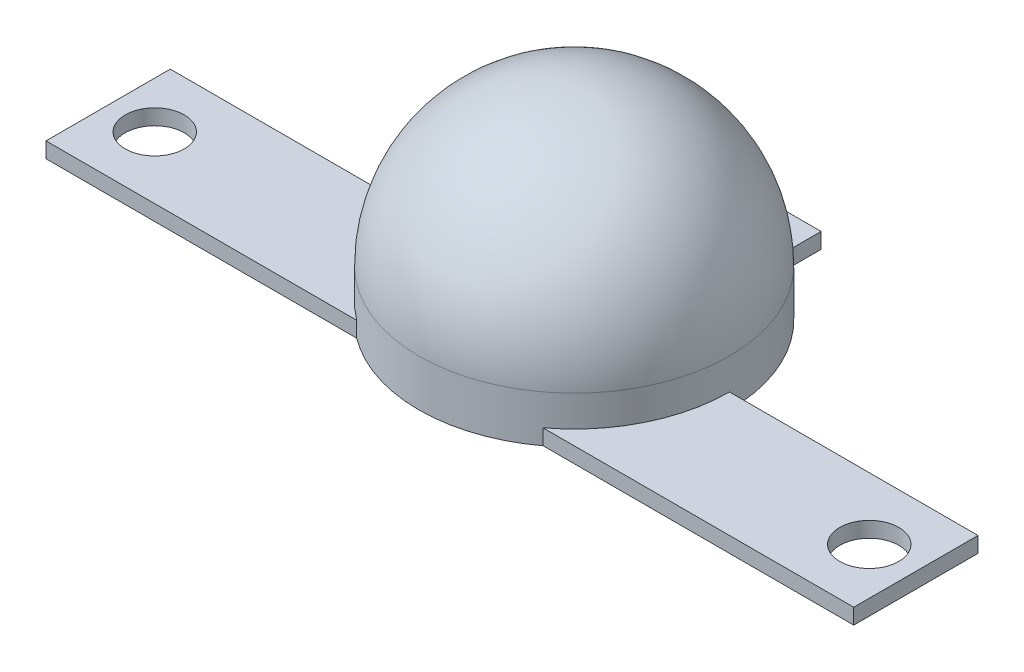
ISO-10303-21;
HEADER;
FILE_DESCRIPTION(('STEP AP214'),'2;1');
FILE_NAME('part.step','',(''),(''),'','','');
FILE_SCHEMA(('AUTOMOTIVE_DESIGN { 1 0 10303 214 1 1 1 1 }'));
ENDSEC;
DATA;
#1=APPLICATION_CONTEXT('core data for automotive mechanical design processes');
#2=APPLICATION_PROTOCOL_DEFINITION('international standard','automotive_design',2000,#1);
#3=PRODUCT_CONTEXT('',#1,'mechanical');
#4=PRODUCT('Part','Part','',(#3));
#5=PRODUCT_RELATED_PRODUCT_CATEGORY('part','',(#4));
#6=PRODUCT_DEFINITION_FORMATION('','',#4);
#7=PRODUCT_DEFINITION_CONTEXT('part definition',#1,'design');
#8=PRODUCT_DEFINITION('design','',#6,#7);
#9=PRODUCT_DEFINITION_SHAPE('','',#8);
#10=(LENGTH_UNIT() NAMED_UNIT(*) SI_UNIT(.MILLI.,.METRE.));
#11=(NAMED_UNIT(*) PLANE_ANGLE_UNIT() SI_UNIT($,.RADIAN.));
#12=(NAMED_UNIT(*) SI_UNIT($,.STERADIAN.) SOLID_ANGLE_UNIT());
#13=UNCERTAINTY_MEASURE_WITH_UNIT(LENGTH_MEASURE(1.E-05),#10,'distance_accuracy_value','');
#14=(GEOMETRIC_REPRESENTATION_CONTEXT(3) GLOBAL_UNCERTAINTY_ASSIGNED_CONTEXT((#13)) GLOBAL_UNIT_ASSIGNED_CONTEXT((#10,
#11,#12)) REPRESENTATION_CONTEXT('',''));
#15=CARTESIAN_POINT('',(0.,0.,0.));
#16=DIRECTION('',(0.,0.,1.));
#17=DIRECTION('',(1.,0.,0.));
#18=AXIS2_PLACEMENT_3D('',#15,#16,#17);
#19=CARTESIAN_POINT('',(0.,13.,0.));
#20=DIRECTION('',(0.,1.,0.));
#21=DIRECTION('',(0.,0.,1.));
#22=AXIS2_PLACEMENT_3D('',#19,#20,#21);
#23=CYLINDRICAL_SURFACE('',#22,10.);
#24=CARTESIAN_POINT('',(0.,3.,0.));
#25=DIRECTION('',(0.,1.,0.));
#26=DIRECTION('',(0.,0.,1.));
#27=AXIS2_PLACEMENT_3D('',#24,#25,#26);
#28=CIRCLE('',#27,10.);
#29=CARTESIAN_POINT('',(0.,3.,10.));
#30=VERTEX_POINT('',#29);
#31=EDGE_CURVE('E281',#30,#30,#28,.T.);
#32=ORIENTED_EDGE('',*,*,#31,.F.);
#33=EDGE_LOOP('',(#32));
#34=FACE_BOUND('',#33,.T.);
#35=CARTESIAN_POINT('',(0.,0.,0.));
#36=DIRECTION('',(0.,1.,0.));
#37=DIRECTION('',(0.,0.,1.));
#38=AXIS2_PLACEMENT_3D('',#35,#36,#37);
#39=CIRCLE('',#38,10.);
#40=CARTESIAN_POINT('',(-6.,0.,8.));
#41=VERTEX_POINT('',#40);
#42=CARTESIAN_POINT('',(6.,0.,8.));
#43=VERTEX_POINT('',#42);
#44=EDGE_CURVE('E270',#41,#43,#39,.T.);
#45=ORIENTED_EDGE('',*,*,#44,.T.);
#46=DIRECTION('',(0.,1.,0.));
#47=VECTOR('',#46,1.);
#48=CARTESIAN_POINT('',(6.,13.,8.));
#49=LINE('',#48,#47);
#50=CARTESIAN_POINT('',(6.,0.999999999999999,8.));
#51=VERTEX_POINT('',#50);
#52=EDGE_CURVE('E61',#43,#51,#49,.T.);
#53=ORIENTED_EDGE('',*,*,#52,.T.);
#54=CARTESIAN_POINT('',(0.,0.999999999999999,0.));
#55=DIRECTION('',(0.,1.,0.));
#56=DIRECTION('',(0.,0.,1.));
#57=AXIS2_PLACEMENT_3D('',#54,#55,#56);
#58=CIRCLE('',#57,10.);
#59=CARTESIAN_POINT('',(10.,0.999999999999999,0.));
#60=VERTEX_POINT('',#59);
#61=EDGE_CURVE('E56',#51,#60,#58,.T.);
#62=ORIENTED_EDGE('',*,*,#61,.T.);
#63=DIRECTION('',(0.,1.,0.));
#64=VECTOR('',#63,1.);
#65=CARTESIAN_POINT('',(10.,13.,0.));
#66=LINE('',#65,#64);
#67=CARTESIAN_POINT('',(10.,0.,0.));
#68=VERTEX_POINT('',#67);
#69=EDGE_CURVE('E255',#68,#60,#66,.T.);
#70=ORIENTED_EDGE('',*,*,#69,.F.);
#71=CARTESIAN_POINT('',(4.,0.,-9.16515138991168));
#72=VERTEX_POINT('',#71);
#73=EDGE_CURVE('E273',#68,#72,#39,.T.);
#74=ORIENTED_EDGE('',*,*,#73,.T.);
#75=DIRECTION('',(0.,1.,0.));
#76=VECTOR('',#75,1.);
#77=CARTESIAN_POINT('',(4.,13.,-9.16515138991168));
#78=LINE('',#77,#76);
#79=CARTESIAN_POINT('',(4.,0.999999999999999,-9.16515138991168));
#80=VERTEX_POINT('',#79);
#81=EDGE_CURVE('E249',#80,#72,#78,.F.);
#82=ORIENTED_EDGE('',*,*,#81,.F.);
#83=CARTESIAN_POINT('',(-4.,0.999999999999999,-9.16515138991168));
#84=VERTEX_POINT('',#83);
#85=EDGE_CURVE('E269',#80,#84,#58,.T.);
#86=ORIENTED_EDGE('',*,*,#85,.T.);
#87=DIRECTION('',(0.,1.,0.));
#88=VECTOR('',#87,1.);
#89=CARTESIAN_POINT('',(-4.,13.,-9.16515138991168));
#90=LINE('',#89,#88);
#91=CARTESIAN_POINT('',(-4.,0.,-9.16515138991168));
#92=VERTEX_POINT('',#91);
#93=EDGE_CURVE('E244',#84,#92,#90,.F.);
#94=ORIENTED_EDGE('',*,*,#93,.T.);
#95=CARTESIAN_POINT('',(-10.,0.,0.));
#96=VERTEX_POINT('',#95);
#97=EDGE_CURVE('E272',#92,#96,#39,.T.);
#98=ORIENTED_EDGE('',*,*,#97,.T.);
#99=DIRECTION('',(0.,1.,0.));
#100=VECTOR('',#99,1.);
#101=CARTESIAN_POINT('',(-10.,13.,0.));
#102=LINE('',#101,#100);
#103=CARTESIAN_POINT('',(-10.,0.999999999999999,0.));
#104=VERTEX_POINT('',#103);
#105=EDGE_CURVE('E238',#104,#96,#102,.F.);
#106=ORIENTED_EDGE('',*,*,#105,.F.);
#107=CARTESIAN_POINT('',(-6.,0.999999999999999,8.));
#108=VERTEX_POINT('',#107);
#109=EDGE_CURVE('E267',#104,#108,#58,.T.);
#110=ORIENTED_EDGE('',*,*,#109,.T.);
#111=DIRECTION('',(0.,1.,0.));
#112=VECTOR('',#111,1.);
#113=CARTESIAN_POINT('',(-6.,13.,8.));
#114=LINE('',#113,#112);
#115=EDGE_CURVE('E263',#108,#41,#114,.F.);
#116=ORIENTED_EDGE('',*,*,#115,.T.);
#117=EDGE_LOOP('',(#45,#53,#62,#70,#74,#82,#86,#94,#98,#106,#110,#116));
#118=FACE_BOUND('',#117,.T.);
#119=ADVANCED_FACE('F41',(#34,#118),#23,.T.);
#120=CARTESIAN_POINT('',(0.,13.,0.));
#121=DIRECTION('',(0.,1.,0.));
#122=DIRECTION('',(0.,0.,1.));
#123=AXIS2_PLACEMENT_3D('',#120,#121,#122);
#124=CYLINDRICAL_SURFACE('',#123,8.8);
#125=CARTESIAN_POINT('',(0.,3.,0.));
#126=DIRECTION('',(0.,1.,0.));
#127=DIRECTION('',(0.,0.,1.));
#128=AXIS2_PLACEMENT_3D('',#125,#126,#127);
#129=CIRCLE('',#128,8.8);
#130=CARTESIAN_POINT('',(0.,3.,8.8));
#131=VERTEX_POINT('',#130);
#132=EDGE_CURVE('E279',#131,#131,#129,.T.);
#133=ORIENTED_EDGE('',*,*,#132,.T.);
#134=EDGE_LOOP('',(#133));
#135=FACE_BOUND('',#134,.T.);
#136=CARTESIAN_POINT('',(0.,0.,0.));
#137=DIRECTION('',(0.,1.,0.));
#138=DIRECTION('',(0.,0.,1.));
#139=AXIS2_PLACEMENT_3D('',#136,#137,#138);
#140=CIRCLE('',#139,8.8);
#141=CARTESIAN_POINT('',(-3.66606055596467,0.,8.));
#142=VERTEX_POINT('',#141);
#143=CARTESIAN_POINT('',(3.66606055596468,0.,8.));
#144=VERTEX_POINT('',#143);
#145=EDGE_CURVE('E274',#142,#144,#140,.T.);
#146=ORIENTED_EDGE('',*,*,#145,.F.);
#147=DIRECTION('',(0.,1.,0.));
#148=VECTOR('',#147,1.);
#149=CARTESIAN_POINT('',(-3.66606055596467,13.,8.));
#150=LINE('',#149,#148);
#151=CARTESIAN_POINT('',(-3.66606055596467,0.999999999999999,8.));
#152=VERTEX_POINT('',#151);
#153=EDGE_CURVE('E257',#142,#152,#150,.T.);
#154=ORIENTED_EDGE('',*,*,#153,.T.);
#155=CARTESIAN_POINT('',(0.,0.999999999999999,0.));
#156=DIRECTION('',(0.,1.,0.));
#157=DIRECTION('',(0.,0.,1.));
#158=AXIS2_PLACEMENT_3D('',#155,#156,#157);
#159=CIRCLE('',#158,8.8);
#160=CARTESIAN_POINT('',(-8.8,0.999999999999999,0.));
#161=VERTEX_POINT('',#160);
#162=EDGE_CURVE('E11',#152,#161,#159,.F.);
#163=ORIENTED_EDGE('',*,*,#162,.T.);
#164=DIRECTION('',(0.,1.,0.));
#165=VECTOR('',#164,1.);
#166=CARTESIAN_POINT('',(-8.8,13.,0.));
#167=LINE('',#166,#165);
#168=CARTESIAN_POINT('',(-8.8,0.,0.));
#169=VERTEX_POINT('',#168);
#170=EDGE_CURVE('E186',#169,#161,#167,.T.);
#171=ORIENTED_EDGE('',*,*,#170,.F.);
#172=CARTESIAN_POINT('',(-4.,0.,-7.83836717690617));
#173=VERTEX_POINT('',#172);
#174=EDGE_CURVE('E277',#173,#169,#140,.T.);
#175=ORIENTED_EDGE('',*,*,#174,.F.);
#176=DIRECTION('',(0.,1.,0.));
#177=VECTOR('',#176,1.);
#178=CARTESIAN_POINT('',(-4.,13.,-7.83836717690617));
#179=LINE('',#178,#177);
#180=CARTESIAN_POINT('',(-4.,0.999999999999999,-7.83836717690617));
#181=VERTEX_POINT('',#180);
#182=EDGE_CURVE('E241',#173,#181,#179,.T.);
#183=ORIENTED_EDGE('',*,*,#182,.T.);
#184=CARTESIAN_POINT('',(4.,0.999999999999999,-7.83836717690617));
#185=VERTEX_POINT('',#184);
#186=EDGE_CURVE('E49',#181,#185,#159,.F.);
#187=ORIENTED_EDGE('',*,*,#186,.T.);
#188=DIRECTION('',(0.,1.,0.));
#189=VECTOR('',#188,1.);
#190=CARTESIAN_POINT('',(4.,13.,-7.83836717690617));
#191=LINE('',#190,#189);
#192=CARTESIAN_POINT('',(4.,0.,-7.83836717690617));
#193=VERTEX_POINT('',#192);
#194=EDGE_CURVE('E247',#193,#185,#191,.T.);
#195=ORIENTED_EDGE('',*,*,#194,.F.);
#196=CARTESIAN_POINT('',(8.8,0.,0.));
#197=VERTEX_POINT('',#196);
#198=EDGE_CURVE('E278',#197,#193,#140,.T.);
#199=ORIENTED_EDGE('',*,*,#198,.F.);
#200=DIRECTION('',(0.,1.,0.));
#201=VECTOR('',#200,1.);
#202=CARTESIAN_POINT('',(8.8,13.,0.));
#203=LINE('',#202,#201);
#204=CARTESIAN_POINT('',(8.8,0.999999999999999,0.));
#205=VERTEX_POINT('',#204);
#206=EDGE_CURVE('E252',#205,#197,#203,.F.);
#207=ORIENTED_EDGE('',*,*,#206,.F.);
#208=CARTESIAN_POINT('',(3.66606055596468,0.999999999999999,8.));
#209=VERTEX_POINT('',#208);
#210=EDGE_CURVE('E44',#205,#209,#159,.F.);
#211=ORIENTED_EDGE('',*,*,#210,.T.);
#212=DIRECTION('',(0.,1.,0.));
#213=VECTOR('',#212,1.);
#214=CARTESIAN_POINT('',(3.66606055596468,13.,8.));
#215=LINE('',#214,#213);
#216=EDGE_CURVE('E260',#209,#144,#215,.F.);
#217=ORIENTED_EDGE('',*,*,#216,.T.);
#218=EDGE_LOOP('',(#146,#154,#163,#171,#175,#183,#187,#195,#199,#207,#211,#217));
#219=FACE_BOUND('',#218,.T.);
#220=ADVANCED_FACE('F291',(#135,#219),#124,.F.);
#221=CARTESIAN_POINT('',(0.,3.,0.));
#222=DIRECTION('',(0.,1.,0.));
#223=DIRECTION('',(1.,0.,0.));
#224=AXIS2_PLACEMENT_3D('',#221,#222,#223);
#225=SPHERICAL_SURFACE('',#224,10.);
#226=ORIENTED_EDGE('',*,*,#31,.T.);
#227=EDGE_LOOP('',(#226));
#228=FACE_BOUND('',#227,.T.);
#229=ADVANCED_FACE('F389',(#228),#225,.T.);
#230=CARTESIAN_POINT('',(0.,3.,0.));
#231=DIRECTION('',(0.,1.,0.));
#232=DIRECTION('',(-1.,0.,0.));
#233=AXIS2_PLACEMENT_3D('',#230,#231,#232);
#234=SPHERICAL_SURFACE('',#233,8.8);
#235=ORIENTED_EDGE('',*,*,#132,.F.);
#236=EDGE_LOOP('',(#235));
#237=FACE_BOUND('',#236,.T.);
#238=ADVANCED_FACE('F395',(#237),#234,.F.);
#239=CARTESIAN_POINT('',(8.8,0.,0.));
#240=DIRECTION('',(0.,1.,0.));
#241=DIRECTION('',(0.,0.,1.));
#242=AXIS2_PLACEMENT_3D('',#239,#240,#241);
#243=PLANE('',#242);
#244=DIRECTION('',(-1.,0.,0.));
#245=VECTOR('',#244,1.);
#246=CARTESIAN_POINT('',(0.,0.,8.));
#247=LINE('',#246,#245);
#248=EDGE_CURVE('E328',#144,#142,#247,.T.);
#249=ORIENTED_EDGE('',*,*,#248,.T.);
#250=ORIENTED_EDGE('',*,*,#145,.T.);
#251=EDGE_LOOP('',(#249,#250));
#252=FACE_BOUND('',#251,.T.);
#253=DIRECTION('',(0.,0.,-1.));
#254=VECTOR('',#253,1.);
#255=CARTESIAN_POINT('',(-4.,0.,0.));
#256=LINE('',#255,#254);
#257=CARTESIAN_POINT('',(-4.,0.,0.));
#258=VERTEX_POINT('',#257);
#259=EDGE_CURVE('E342',#258,#173,#256,.T.);
#260=ORIENTED_EDGE('',*,*,#259,.T.);
#261=ORIENTED_EDGE('',*,*,#174,.T.);
#262=DIRECTION('',(-1.,0.,0.));
#263=VECTOR('',#262,1.);
#264=CARTESIAN_POINT('',(0.,0.,0.));
#265=LINE('',#264,#263);
#266=EDGE_CURVE('E345',#258,#169,#265,.T.);
#267=ORIENTED_EDGE('',*,*,#266,.F.);
#268=EDGE_LOOP('',(#260,#261,#267));
#269=FACE_BOUND('',#268,.T.);
#270=ORIENTED_EDGE('',*,*,#198,.T.);
#271=DIRECTION('',(0.,0.,-1.));
#272=VECTOR('',#271,1.);
#273=CARTESIAN_POINT('',(4.,0.,0.));
#274=LINE('',#273,#272);
#275=CARTESIAN_POINT('',(4.,0.,0.));
#276=VERTEX_POINT('',#275);
#277=EDGE_CURVE('E336',#276,#193,#274,.T.);
#278=ORIENTED_EDGE('',*,*,#277,.F.);
#279=DIRECTION('',(-1.,0.,0.));
#280=VECTOR('',#279,1.);
#281=CARTESIAN_POINT('',(0.,0.,0.));
#282=LINE('',#281,#280);
#283=EDGE_CURVE('E331',#197,#276,#282,.T.);
#284=ORIENTED_EDGE('',*,*,#283,.F.);
#285=EDGE_LOOP('',(#270,#278,#284));
#286=FACE_BOUND('',#285,.T.);
#287=ORIENTED_EDGE('',*,*,#97,.F.);
#288=CARTESIAN_POINT('',(-4.,0.,-11.9));
#289=VERTEX_POINT('',#288);
#290=EDGE_CURVE('E341',#92,#289,#256,.T.);
#291=ORIENTED_EDGE('',*,*,#290,.T.);
#292=DIRECTION('',(-1.,0.,0.));
#293=VECTOR('',#292,1.);
#294=CARTESIAN_POINT('',(0.,0.,-11.9));
#295=LINE('',#294,#293);
#296=CARTESIAN_POINT('',(4.,0.,-11.9));
#297=VERTEX_POINT('',#296);
#298=EDGE_CURVE('E338',#297,#289,#295,.T.);
#299=ORIENTED_EDGE('',*,*,#298,.F.);
#300=EDGE_CURVE('E335',#72,#297,#274,.T.);
#301=ORIENTED_EDGE('',*,*,#300,.F.);
#302=ORIENTED_EDGE('',*,*,#73,.F.);
#303=CARTESIAN_POINT('',(26.,0.,0.));
#304=VERTEX_POINT('',#303);
#305=EDGE_CURVE('E332',#304,#68,#282,.T.);
#306=ORIENTED_EDGE('',*,*,#305,.F.);
#307=DIRECTION('',(0.,0.,-1.));
#308=VECTOR('',#307,1.);
#309=CARTESIAN_POINT('',(26.,0.,0.));
#310=LINE('',#309,#308);
#311=CARTESIAN_POINT('',(26.,0.,7.99999999999999));
#312=VERTEX_POINT('',#311);
#313=EDGE_CURVE('E327',#312,#304,#310,.T.);
#314=ORIENTED_EDGE('',*,*,#313,.F.);
#315=EDGE_CURVE('E183',#312,#43,#247,.T.);
#316=ORIENTED_EDGE('',*,*,#315,.T.);
#317=ORIENTED_EDGE('',*,*,#44,.F.);
#318=CARTESIAN_POINT('',(-26.,0.,8.00000000000001));
#319=VERTEX_POINT('',#318);
#320=EDGE_CURVE('E329',#41,#319,#247,.T.);
#321=ORIENTED_EDGE('',*,*,#320,.T.);
#322=DIRECTION('',(0.,0.,-1.));
#323=VECTOR('',#322,1.);
#324=CARTESIAN_POINT('',(-26.,0.,0.));
#325=LINE('',#324,#323);
#326=CARTESIAN_POINT('',(-26.,0.,0.));
#327=VERTEX_POINT('',#326);
#328=EDGE_CURVE('E215',#319,#327,#325,.T.);
#329=ORIENTED_EDGE('',*,*,#328,.T.);
#330=EDGE_CURVE('E344',#96,#327,#265,.T.);
#331=ORIENTED_EDGE('',*,*,#330,.F.);
#332=EDGE_LOOP('',(#287,#291,#299,#301,#302,#306,#314,#316,#317,#321,#329,#331));
#333=FACE_BOUND('',#332,.T.);
#334=CARTESIAN_POINT('',(-23.,0.,4.));
#335=DIRECTION('',(0.,1.,0.));
#336=DIRECTION('',(0.,0.,1.));
#337=AXIS2_PLACEMENT_3D('',#334,#335,#336);
#338=CIRCLE('',#337,1.9);
#339=CARTESIAN_POINT('',(-23.,0.,5.9));
#340=VERTEX_POINT('',#339);
#341=EDGE_CURVE('E210',#340,#340,#338,.T.);
#342=ORIENTED_EDGE('',*,*,#341,.T.);
#343=EDGE_LOOP('',(#342));
#344=FACE_BOUND('',#343,.T.);
#345=CARTESIAN_POINT('',(23.,0.,4.));
#346=DIRECTION('',(0.,1.,0.));
#347=DIRECTION('',(0.,0.,1.));
#348=AXIS2_PLACEMENT_3D('',#345,#346,#347);
#349=CIRCLE('',#348,1.9);
#350=CARTESIAN_POINT('',(23.,0.,5.9));
#351=VERTEX_POINT('',#350);
#352=EDGE_CURVE('E203',#351,#351,#349,.F.);
#353=ORIENTED_EDGE('',*,*,#352,.F.);
#354=EDGE_LOOP('',(#353));
#355=FACE_BOUND('',#354,.T.);
#356=ADVANCED_FACE('F350',(#252,#269,#286,#333,#344,#355),#243,.F.);
#357=CARTESIAN_POINT('',(0.,1.,0.));
#358=DIRECTION('',(0.,1.,0.));
#359=DIRECTION('',(0.,0.,1.));
#360=AXIS2_PLACEMENT_3D('',#357,#358,#359);
#361=PLANE('',#360);
#362=ORIENTED_EDGE('',*,*,#162,.F.);
#363=DIRECTION('',(-1.,0.,0.));
#364=VECTOR('',#363,1.);
#365=CARTESIAN_POINT('',(0.,1.,8.));
#366=LINE('',#365,#364);
#367=EDGE_CURVE('E199',#209,#152,#366,.T.);
#368=ORIENTED_EDGE('',*,*,#367,.F.);
#369=ORIENTED_EDGE('',*,*,#210,.F.);
#370=DIRECTION('',(-1.,0.,0.));
#371=VECTOR('',#370,1.);
#372=CARTESIAN_POINT('',(0.,1.,0.));
#373=LINE('',#372,#371);
#374=CARTESIAN_POINT('',(4.,1.,0.));
#375=VERTEX_POINT('',#374);
#376=EDGE_CURVE('E196',#205,#375,#373,.T.);
#377=ORIENTED_EDGE('',*,*,#376,.T.);
#378=DIRECTION('',(0.,0.,-1.));
#379=VECTOR('',#378,1.);
#380=CARTESIAN_POINT('',(4.,1.,0.));
#381=LINE('',#380,#379);
#382=EDGE_CURVE('E304',#375,#185,#381,.T.);
#383=ORIENTED_EDGE('',*,*,#382,.T.);
#384=ORIENTED_EDGE('',*,*,#186,.F.);
#385=DIRECTION('',(0.,0.,-1.));
#386=VECTOR('',#385,1.);
#387=CARTESIAN_POINT('',(-4.,1.,0.));
#388=LINE('',#387,#386);
#389=CARTESIAN_POINT('',(-4.,1.,0.));
#390=VERTEX_POINT('',#389);
#391=EDGE_CURVE('E302',#390,#181,#388,.T.);
#392=ORIENTED_EDGE('',*,*,#391,.F.);
#393=DIRECTION('',(-1.,0.,0.));
#394=VECTOR('',#393,1.);
#395=CARTESIAN_POINT('',(0.,1.,0.));
#396=LINE('',#395,#394);
#397=EDGE_CURVE('E312',#390,#161,#396,.T.);
#398=ORIENTED_EDGE('',*,*,#397,.T.);
#399=EDGE_LOOP('',(#362,#368,#369,#377,#383,#384,#392,#398));
#400=FACE_BOUND('',#399,.T.);
#401=ADVANCED_FACE('F300',(#400),#361,.T.);
#402=CARTESIAN_POINT('',(0.,1.,0.));
#403=DIRECTION('',(0.,0.,1.));
#404=DIRECTION('',(1.,0.,0.));
#405=AXIS2_PLACEMENT_3D('',#402,#403,#404);
#406=PLANE('',#405);
#407=ORIENTED_EDGE('',*,*,#266,.T.);
#408=ORIENTED_EDGE('',*,*,#170,.T.);
#409=ORIENTED_EDGE('',*,*,#397,.F.);
#410=DIRECTION('',(0.,-1.,0.));
#411=VECTOR('',#410,1.);
#412=CARTESIAN_POINT('',(-4.,1.,0.));
#413=LINE('',#412,#411);
#414=EDGE_CURVE('E225',#390,#258,#413,.T.);
#415=ORIENTED_EDGE('',*,*,#414,.T.);
#416=EDGE_LOOP('',(#407,#408,#409,#415));
#417=FACE_BOUND('',#416,.T.);
#418=ADVANCED_FACE('F374',(#417),#406,.F.);
#419=CARTESIAN_POINT('',(-4.,1.,0.));
#420=DIRECTION('',(-1.,0.,0.));
#421=DIRECTION('',(0.,0.,1.));
#422=AXIS2_PLACEMENT_3D('',#419,#420,#421);
#423=PLANE('',#422);
#424=ORIENTED_EDGE('',*,*,#182,.F.);
#425=ORIENTED_EDGE('',*,*,#259,.F.);
#426=ORIENTED_EDGE('',*,*,#414,.F.);
#427=ORIENTED_EDGE('',*,*,#391,.T.);
#428=EDGE_LOOP('',(#424,#425,#426,#427));
#429=FACE_BOUND('',#428,.T.);
#430=ADVANCED_FACE('F306',(#429),#423,.T.);
#431=CARTESIAN_POINT('',(4.,1.,0.));
#432=DIRECTION('',(-1.,0.,0.));
#433=DIRECTION('',(0.,0.,1.));
#434=AXIS2_PLACEMENT_3D('',#431,#432,#433);
#435=PLANE('',#434);
#436=ORIENTED_EDGE('',*,*,#277,.T.);
#437=ORIENTED_EDGE('',*,*,#194,.T.);
#438=ORIENTED_EDGE('',*,*,#382,.F.);
#439=DIRECTION('',(0.,-1.,0.));
#440=VECTOR('',#439,1.);
#441=CARTESIAN_POINT('',(4.,1.,0.));
#442=LINE('',#441,#440);
#443=EDGE_CURVE('E233',#375,#276,#442,.T.);
#444=ORIENTED_EDGE('',*,*,#443,.T.);
#445=EDGE_LOOP('',(#436,#437,#438,#444));
#446=FACE_BOUND('',#445,.T.);
#447=ADVANCED_FACE('F426',(#446),#435,.F.);
#448=CARTESIAN_POINT('',(0.,1.,0.));
#449=DIRECTION('',(0.,0.,1.));
#450=DIRECTION('',(1.,0.,0.));
#451=AXIS2_PLACEMENT_3D('',#448,#449,#450);
#452=PLANE('',#451);
#453=ORIENTED_EDGE('',*,*,#376,.F.);
#454=ORIENTED_EDGE('',*,*,#206,.T.);
#455=ORIENTED_EDGE('',*,*,#283,.T.);
#456=ORIENTED_EDGE('',*,*,#443,.F.);
#457=EDGE_LOOP('',(#453,#454,#455,#456));
#458=FACE_BOUND('',#457,.T.);
#459=ADVANCED_FACE('F420',(#458),#452,.F.);
#460=CARTESIAN_POINT('',(0.,1.,8.));
#461=DIRECTION('',(0.,0.,1.));
#462=DIRECTION('',(1.,0.,0.));
#463=AXIS2_PLACEMENT_3D('',#460,#461,#462);
#464=PLANE('',#463);
#465=ORIENTED_EDGE('',*,*,#216,.F.);
#466=ORIENTED_EDGE('',*,*,#367,.T.);
#467=ORIENTED_EDGE('',*,*,#153,.F.);
#468=ORIENTED_EDGE('',*,*,#248,.F.);
#469=EDGE_LOOP('',(#465,#466,#467,#468));
#470=FACE_BOUND('',#469,.T.);
#471=ADVANCED_FACE('F418',(#470),#464,.T.);
#472=CARTESIAN_POINT('',(-26.,1.,0.));
#473=DIRECTION('',(-1.,0.,0.));
#474=DIRECTION('',(0.,0.,1.));
#475=AXIS2_PLACEMENT_3D('',#472,#473,#474);
#476=PLANE('',#475);
#477=ORIENTED_EDGE('',*,*,#328,.F.);
#478=DIRECTION('',(0.,-1.,0.));
#479=VECTOR('',#478,1.);
#480=CARTESIAN_POINT('',(-26.,1.,8.00000000000001));
#481=LINE('',#480,#479);
#482=CARTESIAN_POINT('',(-26.,1.,8.00000000000001));
#483=VERTEX_POINT('',#482);
#484=EDGE_CURVE('E219',#483,#319,#481,.T.);
#485=ORIENTED_EDGE('',*,*,#484,.F.);
#486=DIRECTION('',(0.,0.,-1.));
#487=VECTOR('',#486,1.);
#488=CARTESIAN_POINT('',(-26.,1.,0.));
#489=LINE('',#488,#487);
#490=CARTESIAN_POINT('',(-26.,1.,0.));
#491=VERTEX_POINT('',#490);
#492=EDGE_CURVE('E318',#483,#491,#489,.T.);
#493=ORIENTED_EDGE('',*,*,#492,.T.);
#494=DIRECTION('',(0.,-1.,0.));
#495=VECTOR('',#494,1.);
#496=CARTESIAN_POINT('',(-26.,1.,0.));
#497=LINE('',#496,#495);
#498=EDGE_CURVE('E221',#491,#327,#497,.T.);
#499=ORIENTED_EDGE('',*,*,#498,.T.);
#500=EDGE_LOOP('',(#477,#485,#493,#499));
#501=FACE_BOUND('',#500,.T.);
#502=ADVANCED_FACE('F354',(#501),#476,.T.);
#503=CARTESIAN_POINT('',(-23.,1.,4.));
#504=DIRECTION('',(0.,-1.,0.));
#505=DIRECTION('',(0.,0.,-1.));
#506=AXIS2_PLACEMENT_3D('',#503,#504,#505);
#507=CYLINDRICAL_SURFACE('',#506,1.9);
#508=CARTESIAN_POINT('',(-23.,1.,4.));
#509=DIRECTION('',(0.,1.,0.));
#510=DIRECTION('',(0.,0.,1.));
#511=AXIS2_PLACEMENT_3D('',#508,#509,#510);
#512=CIRCLE('',#511,1.9);
#513=CARTESIAN_POINT('',(-23.,1.,5.9));
#514=VERTEX_POINT('',#513);
#515=EDGE_CURVE('E321',#514,#514,#512,.T.);
#516=ORIENTED_EDGE('',*,*,#515,.T.);
#517=EDGE_LOOP('',(#516));
#518=FACE_BOUND('',#517,.T.);
#519=ORIENTED_EDGE('',*,*,#341,.F.);
#520=EDGE_LOOP('',(#519));
#521=FACE_BOUND('',#520,.T.);
#522=ADVANCED_FACE('F364',(#518,#521),#507,.F.);
#523=ORIENTED_EDGE('',*,*,#515,.F.);
#524=EDGE_LOOP('',(#523));
#525=FACE_BOUND('',#524,.T.);
#526=ORIENTED_EDGE('',*,*,#109,.F.);
#527=EDGE_CURVE('E309',#104,#491,#396,.T.);
#528=ORIENTED_EDGE('',*,*,#527,.T.);
#529=ORIENTED_EDGE('',*,*,#492,.F.);
#530=EDGE_CURVE('E201',#108,#483,#366,.T.);
#531=ORIENTED_EDGE('',*,*,#530,.F.);
#532=EDGE_LOOP('',(#526,#528,#529,#531));
#533=FACE_BOUND('',#532,.T.);
#534=ADVANCED_FACE('F362',(#525,#533),#361,.T.);
#535=ORIENTED_EDGE('',*,*,#527,.F.);
#536=ORIENTED_EDGE('',*,*,#105,.T.);
#537=ORIENTED_EDGE('',*,*,#330,.T.);
#538=ORIENTED_EDGE('',*,*,#498,.F.);
#539=EDGE_LOOP('',(#535,#536,#537,#538));
#540=FACE_BOUND('',#539,.T.);
#541=ADVANCED_FACE('F359',(#540),#406,.F.);
#542=ORIENTED_EDGE('',*,*,#115,.F.);
#543=ORIENTED_EDGE('',*,*,#530,.T.);
#544=ORIENTED_EDGE('',*,*,#484,.T.);
#545=ORIENTED_EDGE('',*,*,#320,.F.);
#546=EDGE_LOOP('',(#542,#543,#544,#545));
#547=FACE_BOUND('',#546,.T.);
#548=ADVANCED_FACE('F372',(#547),#464,.T.);
#549=CARTESIAN_POINT('',(0.,1.,-11.9));
#550=DIRECTION('',(0.,0.,1.));
#551=DIRECTION('',(1.,0.,0.));
#552=AXIS2_PLACEMENT_3D('',#549,#550,#551);
#553=PLANE('',#552);
#554=ORIENTED_EDGE('',*,*,#298,.T.);
#555=DIRECTION('',(0.,-1.,0.));
#556=VECTOR('',#555,1.);
#557=CARTESIAN_POINT('',(-4.,1.,-11.9));
#558=LINE('',#557,#556);
#559=CARTESIAN_POINT('',(-4.,1.,-11.9));
#560=VERTEX_POINT('',#559);
#561=EDGE_CURVE('E227',#560,#289,#558,.T.);
#562=ORIENTED_EDGE('',*,*,#561,.F.);
#563=DIRECTION('',(-1.,0.,0.));
#564=VECTOR('',#563,1.);
#565=CARTESIAN_POINT('',(0.,1.,-11.9));
#566=LINE('',#565,#564);
#567=CARTESIAN_POINT('',(4.,1.,-11.9));
#568=VERTEX_POINT('',#567);
#569=EDGE_CURVE('E314',#568,#560,#566,.T.);
#570=ORIENTED_EDGE('',*,*,#569,.F.);
#571=DIRECTION('',(0.,-1.,0.));
#572=VECTOR('',#571,1.);
#573=CARTESIAN_POINT('',(4.,1.,-11.9));
#574=LINE('',#573,#572);
#575=EDGE_CURVE('E230',#568,#297,#574,.T.);
#576=ORIENTED_EDGE('',*,*,#575,.T.);
#577=EDGE_LOOP('',(#554,#562,#570,#576));
#578=FACE_BOUND('',#577,.T.);
#579=ADVANCED_FACE('F382',(#578),#553,.F.);
#580=ORIENTED_EDGE('',*,*,#85,.F.);
#581=EDGE_CURVE('E441',#80,#568,#381,.T.);
#582=ORIENTED_EDGE('',*,*,#581,.T.);
#583=ORIENTED_EDGE('',*,*,#569,.T.);
#584=EDGE_CURVE('E310',#84,#560,#388,.T.);
#585=ORIENTED_EDGE('',*,*,#584,.F.);
#586=EDGE_LOOP('',(#580,#582,#583,#585));
#587=FACE_BOUND('',#586,.T.);
#588=ADVANCED_FACE('F367',(#587),#361,.T.);
#589=ORIENTED_EDGE('',*,*,#93,.F.);
#590=ORIENTED_EDGE('',*,*,#584,.T.);
#591=ORIENTED_EDGE('',*,*,#561,.T.);
#592=ORIENTED_EDGE('',*,*,#290,.F.);
#593=EDGE_LOOP('',(#589,#590,#591,#592));
#594=FACE_BOUND('',#593,.T.);
#595=ADVANCED_FACE('F381',(#594),#423,.T.);
#596=ORIENTED_EDGE('',*,*,#581,.F.);
#597=ORIENTED_EDGE('',*,*,#81,.T.);
#598=ORIENTED_EDGE('',*,*,#300,.T.);
#599=ORIENTED_EDGE('',*,*,#575,.F.);
#600=EDGE_LOOP('',(#596,#597,#598,#599));
#601=FACE_BOUND('',#600,.T.);
#602=ADVANCED_FACE('F455',(#601),#435,.F.);
#603=CARTESIAN_POINT('',(23.,1.,4.));
#604=DIRECTION('',(0.,1.,0.));
#605=DIRECTION('',(0.,0.,1.));
#606=AXIS2_PLACEMENT_3D('',#603,#604,#605);
#607=CIRCLE('',#606,1.9);
#608=CARTESIAN_POINT('',(23.,1.,5.9));
#609=VERTEX_POINT('',#608);
#610=EDGE_CURVE('E222',#609,#609,#607,.F.);
#611=ORIENTED_EDGE('',*,*,#610,.T.);
#612=EDGE_LOOP('',(#611));
#613=FACE_BOUND('',#612,.T.);
#614=ORIENTED_EDGE('',*,*,#61,.F.);
#615=CARTESIAN_POINT('',(26.,1.,7.99999999999999));
#616=VERTEX_POINT('',#615);
#617=EDGE_CURVE('E181',#616,#51,#366,.T.);
#618=ORIENTED_EDGE('',*,*,#617,.F.);
#619=DIRECTION('',(0.,0.,-1.));
#620=VECTOR('',#619,1.);
#621=CARTESIAN_POINT('',(26.,1.,0.));
#622=LINE('',#621,#620);
#623=CARTESIAN_POINT('',(26.,1.,0.));
#624=VERTEX_POINT('',#623);
#625=EDGE_CURVE('E190',#616,#624,#622,.T.);
#626=ORIENTED_EDGE('',*,*,#625,.T.);
#627=EDGE_CURVE('E440',#624,#60,#373,.T.);
#628=ORIENTED_EDGE('',*,*,#627,.T.);
#629=EDGE_LOOP('',(#614,#618,#626,#628));
#630=FACE_BOUND('',#629,.T.);
#631=ADVANCED_FACE('F198',(#613,#630),#361,.T.);
#632=ORIENTED_EDGE('',*,*,#52,.F.);
#633=ORIENTED_EDGE('',*,*,#315,.F.);
#634=DIRECTION('',(0.,-1.,0.));
#635=VECTOR('',#634,1.);
#636=CARTESIAN_POINT('',(26.,1.,7.99999999999999));
#637=LINE('',#636,#635);
#638=EDGE_CURVE('E177',#616,#312,#637,.T.);
#639=ORIENTED_EDGE('',*,*,#638,.F.);
#640=ORIENTED_EDGE('',*,*,#617,.T.);
#641=EDGE_LOOP('',(#632,#633,#639,#640));
#642=FACE_BOUND('',#641,.T.);
#643=ADVANCED_FACE('F179',(#642),#464,.T.);
#644=ORIENTED_EDGE('',*,*,#305,.T.);
#645=ORIENTED_EDGE('',*,*,#69,.T.);
#646=ORIENTED_EDGE('',*,*,#627,.F.);
#647=DIRECTION('',(0.,-1.,0.));
#648=VECTOR('',#647,1.);
#649=CARTESIAN_POINT('',(26.,1.,0.));
#650=LINE('',#649,#648);
#651=EDGE_CURVE('E187',#624,#304,#650,.T.);
#652=ORIENTED_EDGE('',*,*,#651,.T.);
#653=EDGE_LOOP('',(#644,#645,#646,#652));
#654=FACE_BOUND('',#653,.T.);
#655=ADVANCED_FACE('F429',(#654),#452,.F.);
#656=CARTESIAN_POINT('',(26.,1.,0.));
#657=DIRECTION('',(-1.,0.,0.));
#658=DIRECTION('',(0.,0.,1.));
#659=AXIS2_PLACEMENT_3D('',#656,#657,#658);
#660=PLANE('',#659);
#661=ORIENTED_EDGE('',*,*,#313,.T.);
#662=ORIENTED_EDGE('',*,*,#651,.F.);
#663=ORIENTED_EDGE('',*,*,#625,.F.);
#664=ORIENTED_EDGE('',*,*,#638,.T.);
#665=EDGE_LOOP('',(#661,#662,#663,#664));
#666=FACE_BOUND('',#665,.T.);
#667=ADVANCED_FACE('F191',(#666),#660,.F.);
#668=CARTESIAN_POINT('',(23.,1.,4.));
#669=DIRECTION('',(0.,-1.,0.));
#670=DIRECTION('',(0.,0.,-1.));
#671=AXIS2_PLACEMENT_3D('',#668,#669,#670);
#672=CYLINDRICAL_SURFACE('',#671,1.9);
#673=ORIENTED_EDGE('',*,*,#610,.F.);
#674=EDGE_LOOP('',(#673));
#675=FACE_BOUND('',#674,.T.);
#676=ORIENTED_EDGE('',*,*,#352,.T.);
#677=EDGE_LOOP('',(#676));
#678=FACE_BOUND('',#677,.T.);
#679=ADVANCED_FACE('F475',(#675,#678),#672,.F.);
#680=CLOSED_SHELL('',(#119,#220,#229,#238,#356,#401,#418,#430,#447,#459,#471,#502,#522,#534,
#541,#548,#579,#588,#595,#602,#631,#643,#655,#667,#679));
#681=MANIFOLD_SOLID_BREP('B2',#680);
#682=ADVANCED_BREP_SHAPE_REPRESENTATION('',(#18,#681),#14);
#683=SHAPE_DEFINITION_REPRESENTATION(#9,#682);
ENDSEC;
END-ISO-10303-21;
